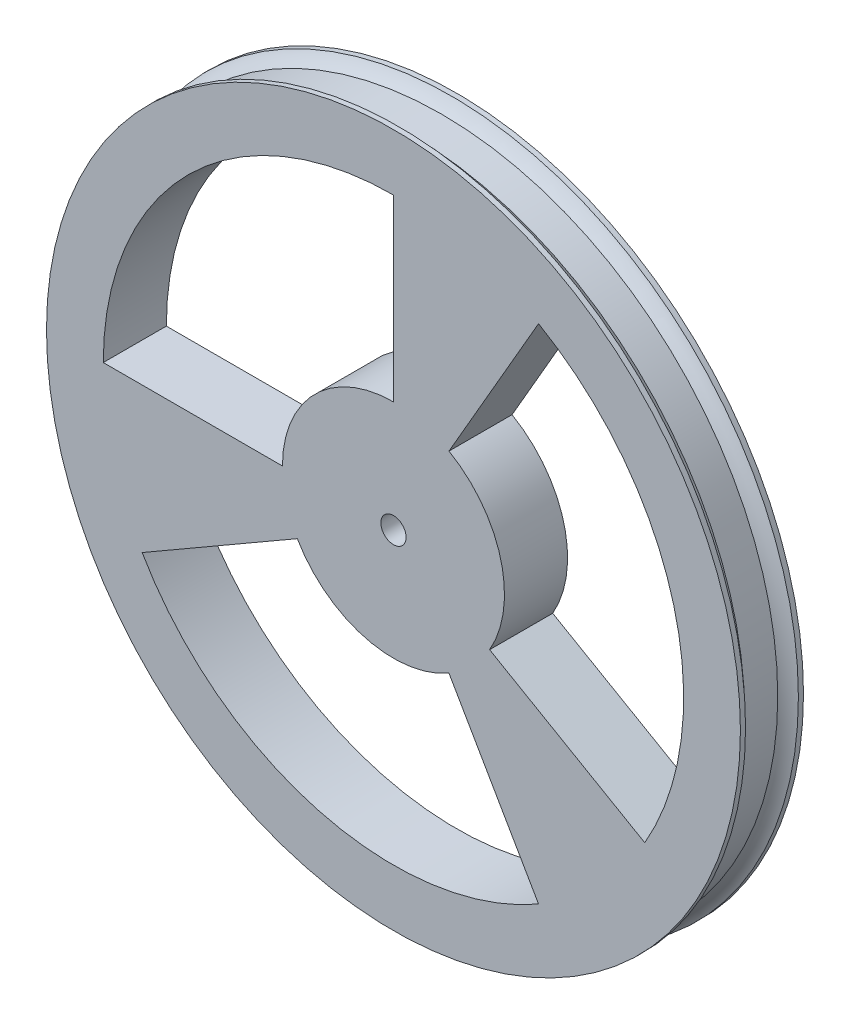
ISO-10303-21;
HEADER;
FILE_DESCRIPTION(('STEP AP214'),'2;1');
FILE_NAME('part.step','',(''),(''),'','','');
FILE_SCHEMA(('AUTOMOTIVE_DESIGN { 1 0 10303 214 1 1 1 1 }'));
ENDSEC;
DATA;
#1=APPLICATION_CONTEXT('core data for automotive mechanical design processes');
#2=APPLICATION_PROTOCOL_DEFINITION('international standard','automotive_design',2000,#1);
#3=PRODUCT_CONTEXT('',#1,'mechanical');
#4=PRODUCT('Part','Part','',(#3));
#5=PRODUCT_RELATED_PRODUCT_CATEGORY('part','',(#4));
#6=PRODUCT_DEFINITION_FORMATION('','',#4);
#7=PRODUCT_DEFINITION_CONTEXT('part definition',#1,'design');
#8=PRODUCT_DEFINITION('design','',#6,#7);
#9=PRODUCT_DEFINITION_SHAPE('','',#8);
#10=(LENGTH_UNIT() NAMED_UNIT(*) SI_UNIT(.MILLI.,.METRE.));
#11=(NAMED_UNIT(*) PLANE_ANGLE_UNIT() SI_UNIT($,.RADIAN.));
#12=(NAMED_UNIT(*) SI_UNIT($,.STERADIAN.) SOLID_ANGLE_UNIT());
#13=UNCERTAINTY_MEASURE_WITH_UNIT(LENGTH_MEASURE(1.E-05),#10,'distance_accuracy_value','');
#14=(GEOMETRIC_REPRESENTATION_CONTEXT(3) GLOBAL_UNCERTAINTY_ASSIGNED_CONTEXT((#13)) GLOBAL_UNIT_ASSIGNED_CONTEXT((#10,
#11,#12)) REPRESENTATION_CONTEXT('',''));
#15=CARTESIAN_POINT('',(0.,0.,0.));
#16=DIRECTION('',(0.,0.,1.));
#17=DIRECTION('',(1.,0.,0.));
#18=AXIS2_PLACEMENT_3D('',#15,#16,#17);
#19=CARTESIAN_POINT('',(0.,0.,5.));
#20=DIRECTION('',(0.,0.,-1.));
#21=DIRECTION('',(-1.,0.,0.));
#22=AXIS2_PLACEMENT_3D('',#19,#20,#21);
#23=CYLINDRICAL_SURFACE('',#22,27.5);
#24=CARTESIAN_POINT('',(0.,0.,5.));
#25=DIRECTION('',(0.,0.,1.));
#26=DIRECTION('',(1.,0.,0.));
#27=AXIS2_PLACEMENT_3D('',#24,#25,#26);
#28=CIRCLE('',#27,27.5);
#29=CARTESIAN_POINT('',(27.5,0.,5.));
#30=VERTEX_POINT('',#29);
#31=EDGE_CURVE('E12',#30,#30,#28,.T.);
#32=ORIENTED_EDGE('',*,*,#31,.F.);
#33=EDGE_LOOP('',(#32));
#34=FACE_BOUND('',#33,.T.);
#35=CARTESIAN_POINT('',(0.,0.,4.59416339647363));
#36=DIRECTION('',(0.,0.,-1.));
#37=DIRECTION('',(-1.,0.,0.));
#38=AXIS2_PLACEMENT_3D('',#35,#36,#37);
#39=CIRCLE('',#38,27.5);
#40=CARTESIAN_POINT('',(-27.5,0.,4.59416339647363));
#41=VERTEX_POINT('',#40);
#42=EDGE_CURVE('E59',#41,#41,#39,.T.);
#43=ORIENTED_EDGE('',*,*,#42,.F.);
#44=EDGE_LOOP('',(#43));
#45=FACE_BOUND('',#44,.T.);
#46=ADVANCED_FACE('F56',(#34,#45),#23,.T.);
#47=CARTESIAN_POINT('',(0.,0.,5.));
#48=DIRECTION('',(0.,0.,1.));
#49=DIRECTION('',(1.,0.,0.));
#50=AXIS2_PLACEMENT_3D('',#47,#48,#49);
#51=PLANE('',#50);
#52=DIRECTION('',(-0.866025403784438,-0.500000000000001,0.));
#53=VECTOR('',#52,1.);
#54=CARTESIAN_POINT('',(0.,0.,5.));
#55=LINE('',#54,#53);
#56=CARTESIAN_POINT('',(-7.62102355330305,-4.40000000000001,5.));
#57=VERTEX_POINT('',#56);
#58=CARTESIAN_POINT('',(-19.9185842870421,-11.5,5.));
#59=VERTEX_POINT('',#58);
#60=EDGE_CURVE('E72',#57,#59,#55,.T.);
#61=ORIENTED_EDGE('',*,*,#60,.F.);
#62=CARTESIAN_POINT('',(0.,0.,5.));
#63=DIRECTION('',(0.,0.,1.));
#64=DIRECTION('',(1.,0.,0.));
#65=AXIS2_PLACEMENT_3D('',#62,#63,#64);
#66=CIRCLE('',#65,8.8);
#67=CARTESIAN_POINT('',(4.39999999999993,-7.6210235533031,5.));
#68=VERTEX_POINT('',#67);
#69=EDGE_CURVE('E162',#57,#68,#66,.T.);
#70=ORIENTED_EDGE('',*,*,#69,.T.);
#71=DIRECTION('',(0.499999999999992,-0.866025403784443,0.));
#72=VECTOR('',#71,1.);
#73=CARTESIAN_POINT('',(0.,0.,5.));
#74=LINE('',#73,#72);
#75=CARTESIAN_POINT('',(11.4999999999998,-19.9185842870422,5.));
#76=VERTEX_POINT('',#75);
#77=EDGE_CURVE('E165',#68,#76,#74,.T.);
#78=ORIENTED_EDGE('',*,*,#77,.T.);
#79=CARTESIAN_POINT('',(0.,0.,5.));
#80=DIRECTION('',(0.,0.,1.));
#81=DIRECTION('',(1.,0.,0.));
#82=AXIS2_PLACEMENT_3D('',#79,#80,#81);
#83=CIRCLE('',#82,23.);
#84=EDGE_CURVE('E171',#59,#76,#83,.T.);
#85=ORIENTED_EDGE('',*,*,#84,.F.);
#86=EDGE_LOOP('',(#61,#70,#78,#85));
#87=FACE_BOUND('',#86,.T.);
#88=DIRECTION('',(0.866025403784435,-0.500000000000007,0.));
#89=VECTOR('',#88,1.);
#90=CARTESIAN_POINT('',(0.,0.,5.));
#91=LINE('',#90,#89);
#92=CARTESIAN_POINT('',(7.62102355330303,-4.40000000000006,5.));
#93=VERTEX_POINT('',#92);
#94=CARTESIAN_POINT('',(19.918584287042,-11.5000000000001,5.));
#95=VERTEX_POINT('',#94);
#96=EDGE_CURVE('E177',#93,#95,#91,.T.);
#97=ORIENTED_EDGE('',*,*,#96,.F.);
#98=CARTESIAN_POINT('',(0.,0.,5.));
#99=DIRECTION('',(0.,0.,1.));
#100=DIRECTION('',(1.,0.,0.));
#101=AXIS2_PLACEMENT_3D('',#98,#99,#100);
#102=CIRCLE('',#101,8.8);
#103=CARTESIAN_POINT('',(4.40000000000006,7.62102355330303,5.));
#104=VERTEX_POINT('',#103);
#105=EDGE_CURVE('E185',#93,#104,#102,.T.);
#106=ORIENTED_EDGE('',*,*,#105,.T.);
#107=DIRECTION('',(0.500000000000006,0.866025403784435,0.));
#108=VECTOR('',#107,1.);
#109=CARTESIAN_POINT('',(0.,0.,5.));
#110=LINE('',#109,#108);
#111=CARTESIAN_POINT('',(11.5000000000001,19.918584287042,5.));
#112=VERTEX_POINT('',#111);
#113=EDGE_CURVE('E198',#104,#112,#110,.T.);
#114=ORIENTED_EDGE('',*,*,#113,.T.);
#115=CARTESIAN_POINT('',(0.,0.,5.));
#116=DIRECTION('',(0.,0.,1.));
#117=DIRECTION('',(1.,0.,0.));
#118=AXIS2_PLACEMENT_3D('',#115,#116,#117);
#119=CIRCLE('',#118,23.);
#120=EDGE_CURVE('E195',#95,#112,#119,.T.);
#121=ORIENTED_EDGE('',*,*,#120,.F.);
#122=EDGE_LOOP('',(#97,#106,#114,#121));
#123=FACE_BOUND('',#122,.T.);
#124=DIRECTION('',(0.,1.,0.));
#125=VECTOR('',#124,1.);
#126=CARTESIAN_POINT('',(0.,0.,5.));
#127=LINE('',#126,#125);
#128=CARTESIAN_POINT('',(0.,8.8,5.));
#129=VERTEX_POINT('',#128);
#130=CARTESIAN_POINT('',(0.,23.,5.));
#131=VERTEX_POINT('',#130);
#132=EDGE_CURVE('E205',#129,#131,#127,.T.);
#133=ORIENTED_EDGE('',*,*,#132,.F.);
#134=CARTESIAN_POINT('',(0.,0.,5.));
#135=DIRECTION('',(0.,0.,1.));
#136=DIRECTION('',(1.,0.,0.));
#137=AXIS2_PLACEMENT_3D('',#134,#135,#136);
#138=CIRCLE('',#137,8.8);
#139=CARTESIAN_POINT('',(-8.8,0.,5.));
#140=VERTEX_POINT('',#139);
#141=EDGE_CURVE('E216',#129,#140,#138,.T.);
#142=ORIENTED_EDGE('',*,*,#141,.T.);
#143=DIRECTION('',(-1.,0.,0.));
#144=VECTOR('',#143,1.);
#145=CARTESIAN_POINT('',(0.,0.,5.));
#146=LINE('',#145,#144);
#147=CARTESIAN_POINT('',(-23.,0.,5.));
#148=VERTEX_POINT('',#147);
#149=EDGE_CURVE('E229',#140,#148,#146,.T.);
#150=ORIENTED_EDGE('',*,*,#149,.T.);
#151=CARTESIAN_POINT('',(0.,0.,5.));
#152=DIRECTION('',(0.,0.,1.));
#153=DIRECTION('',(1.,0.,0.));
#154=AXIS2_PLACEMENT_3D('',#151,#152,#153);
#155=CIRCLE('',#154,23.);
#156=EDGE_CURVE('E226',#131,#148,#155,.T.);
#157=ORIENTED_EDGE('',*,*,#156,.F.);
#158=EDGE_LOOP('',(#133,#142,#150,#157));
#159=FACE_BOUND('',#158,.T.);
#160=CARTESIAN_POINT('',(0.,0.,5.));
#161=DIRECTION('',(0.,0.,1.));
#162=DIRECTION('',(1.,0.,0.));
#163=AXIS2_PLACEMENT_3D('',#160,#161,#162);
#164=CIRCLE('',#163,1.);
#165=CARTESIAN_POINT('',(1.,0.,5.));
#166=VERTEX_POINT('',#165);
#167=EDGE_CURVE('E236',#166,#166,#164,.T.);
#168=ORIENTED_EDGE('',*,*,#167,.F.);
#169=EDGE_LOOP('',(#168));
#170=FACE_BOUND('',#169,.T.);
#171=ORIENTED_EDGE('',*,*,#31,.T.);
#172=EDGE_LOOP('',(#171));
#173=FACE_BOUND('',#172,.T.);
#174=ADVANCED_FACE('F265',(#87,#123,#159,#170,#173),#51,.T.);
#175=CARTESIAN_POINT('',(0.,0.,2.5));
#176=DIRECTION('',(0.,0.,1.));
#177=DIRECTION('',(1.,0.,0.));
#178=AXIS2_PLACEMENT_3D('',#175,#176,#177);
#179=TOROIDAL_SURFACE('',#178,28.6468907779138,2.38765131197873);
#180=CARTESIAN_POINT('',(0.,0.,3.80847837704561));
#181=DIRECTION('',(0.,0.,1.));
#182=DIRECTION('',(1.,0.,0.));
#183=AXIS2_PLACEMENT_3D('',#180,#181,#182);
#184=CIRCLE('',#183,26.6497019725181);
#185=CARTESIAN_POINT('',(26.6497019725181,0.,3.80847837704561));
#186=VERTEX_POINT('',#185);
#187=EDGE_CURVE('E246',#186,#186,#184,.T.);
#188=ORIENTED_EDGE('',*,*,#187,.T.);
#189=EDGE_LOOP('',(#188));
#190=FACE_BOUND('',#189,.T.);
#191=ORIENTED_EDGE('',*,*,#42,.T.);
#192=EDGE_LOOP('',(#191));
#193=FACE_BOUND('',#192,.T.);
#194=ADVANCED_FACE('F262',(#190,#193),#179,.F.);
#195=CARTESIAN_POINT('',(0.,0.,1.19152162295439));
#196=DIRECTION('',(0.,0.,1.));
#197=DIRECTION('',(1.,0.,0.));
#198=AXIS2_PLACEMENT_3D('',#195,#196,#197);
#199=CIRCLE('',#198,26.6497019725181);
#200=CARTESIAN_POINT('',(26.6497019725181,0.,1.19152162295439));
#201=VERTEX_POINT('',#200);
#202=EDGE_CURVE('E251',#201,#201,#199,.T.);
#203=ORIENTED_EDGE('',*,*,#202,.F.);
#204=EDGE_LOOP('',(#203));
#205=FACE_BOUND('',#204,.T.);
#206=CARTESIAN_POINT('',(0.,0.,0.405836603526367));
#207=DIRECTION('',(0.,0.,1.));
#208=DIRECTION('',(1.,0.,0.));
#209=AXIS2_PLACEMENT_3D('',#206,#207,#208);
#210=CIRCLE('',#209,27.5);
#211=CARTESIAN_POINT('',(27.5,0.,0.405836603526367));
#212=VERTEX_POINT('',#211);
#213=EDGE_CURVE('E253',#212,#212,#210,.T.);
#214=ORIENTED_EDGE('',*,*,#213,.T.);
#215=EDGE_LOOP('',(#214));
#216=FACE_BOUND('',#215,.T.);
#217=ADVANCED_FACE('F291',(#205,#216),#179,.F.);
#218=CARTESIAN_POINT('',(0.,0.,5.));
#219=DIRECTION('',(0.,0.,1.));
#220=DIRECTION('',(1.,0.,0.));
#221=AXIS2_PLACEMENT_3D('',#218,#219,#220);
#222=CYLINDRICAL_SURFACE('',#221,26.6497019725181);
#223=ORIENTED_EDGE('',*,*,#202,.T.);
#224=EDGE_LOOP('',(#223));
#225=FACE_BOUND('',#224,.T.);
#226=ORIENTED_EDGE('',*,*,#187,.F.);
#227=EDGE_LOOP('',(#226));
#228=FACE_BOUND('',#227,.T.);
#229=ADVANCED_FACE('F284',(#225,#228),#222,.T.);
#230=CARTESIAN_POINT('',(0.,0.,0.));
#231=DIRECTION('',(0.,0.,1.));
#232=DIRECTION('',(1.,0.,0.));
#233=AXIS2_PLACEMENT_3D('',#230,#231,#232);
#234=PLANE('',#233);
#235=CARTESIAN_POINT('',(0.,0.,0.));
#236=DIRECTION('',(0.,0.,1.));
#237=DIRECTION('',(1.,0.,0.));
#238=AXIS2_PLACEMENT_3D('',#235,#236,#237);
#239=CIRCLE('',#238,8.8);
#240=CARTESIAN_POINT('',(-7.62102355330305,-4.40000000000001,0.));
#241=VERTEX_POINT('',#240);
#242=CARTESIAN_POINT('',(4.39999999999993,-7.6210235533031,0.));
#243=VERTEX_POINT('',#242);
#244=EDGE_CURVE('E151',#241,#243,#239,.T.);
#245=ORIENTED_EDGE('',*,*,#244,.F.);
#246=DIRECTION('',(-0.866025403784438,-0.500000000000001,0.));
#247=VECTOR('',#246,1.);
#248=CARTESIAN_POINT('',(0.,0.,0.));
#249=LINE('',#248,#247);
#250=CARTESIAN_POINT('',(-19.9185842870421,-11.5,0.));
#251=VERTEX_POINT('',#250);
#252=EDGE_CURVE('E148',#241,#251,#249,.T.);
#253=ORIENTED_EDGE('',*,*,#252,.T.);
#254=CARTESIAN_POINT('',(0.,0.,0.));
#255=DIRECTION('',(0.,0.,1.));
#256=DIRECTION('',(1.,0.,0.));
#257=AXIS2_PLACEMENT_3D('',#254,#255,#256);
#258=CIRCLE('',#257,23.);
#259=CARTESIAN_POINT('',(11.4999999999998,-19.9185842870422,0.));
#260=VERTEX_POINT('',#259);
#261=EDGE_CURVE('E154',#251,#260,#258,.T.);
#262=ORIENTED_EDGE('',*,*,#261,.T.);
#263=DIRECTION('',(0.499999999999992,-0.866025403784443,0.));
#264=VECTOR('',#263,1.);
#265=CARTESIAN_POINT('',(0.,0.,0.));
#266=LINE('',#265,#264);
#267=EDGE_CURVE('E158',#243,#260,#266,.T.);
#268=ORIENTED_EDGE('',*,*,#267,.F.);
#269=EDGE_LOOP('',(#245,#253,#262,#268));
#270=FACE_BOUND('',#269,.T.);
#271=CARTESIAN_POINT('',(0.,0.,0.));
#272=DIRECTION('',(0.,0.,1.));
#273=DIRECTION('',(1.,0.,0.));
#274=AXIS2_PLACEMENT_3D('',#271,#272,#273);
#275=CIRCLE('',#274,8.8);
#276=CARTESIAN_POINT('',(7.62102355330303,-4.40000000000006,0.));
#277=VERTEX_POINT('',#276);
#278=CARTESIAN_POINT('',(4.40000000000006,7.62102355330303,0.));
#279=VERTEX_POINT('',#278);
#280=EDGE_CURVE('E191',#277,#279,#275,.T.);
#281=ORIENTED_EDGE('',*,*,#280,.F.);
#282=DIRECTION('',(0.866025403784435,-0.500000000000007,0.));
#283=VECTOR('',#282,1.);
#284=CARTESIAN_POINT('',(0.,0.,0.));
#285=LINE('',#284,#283);
#286=CARTESIAN_POINT('',(19.918584287042,-11.5000000000002,0.));
#287=VERTEX_POINT('',#286);
#288=EDGE_CURVE('E181',#277,#287,#285,.T.);
#289=ORIENTED_EDGE('',*,*,#288,.T.);
#290=CARTESIAN_POINT('',(0.,0.,0.));
#291=DIRECTION('',(0.,0.,1.));
#292=DIRECTION('',(1.,0.,0.));
#293=AXIS2_PLACEMENT_3D('',#290,#291,#292);
#294=CIRCLE('',#293,23.);
#295=CARTESIAN_POINT('',(11.5000000000001,19.918584287042,0.));
#296=VERTEX_POINT('',#295);
#297=EDGE_CURVE('E184',#287,#296,#294,.T.);
#298=ORIENTED_EDGE('',*,*,#297,.T.);
#299=DIRECTION('',(0.500000000000006,0.866025403784435,0.));
#300=VECTOR('',#299,1.);
#301=CARTESIAN_POINT('',(0.,0.,0.));
#302=LINE('',#301,#300);
#303=EDGE_CURVE('E188',#279,#296,#302,.T.);
#304=ORIENTED_EDGE('',*,*,#303,.F.);
#305=EDGE_LOOP('',(#281,#289,#298,#304));
#306=FACE_BOUND('',#305,.T.);
#307=CARTESIAN_POINT('',(0.,0.,0.));
#308=DIRECTION('',(0.,0.,1.));
#309=DIRECTION('',(1.,0.,0.));
#310=AXIS2_PLACEMENT_3D('',#307,#308,#309);
#311=CIRCLE('',#310,8.8);
#312=CARTESIAN_POINT('',(0.,8.8,0.));
#313=VERTEX_POINT('',#312);
#314=CARTESIAN_POINT('',(-8.8,0.,0.));
#315=VERTEX_POINT('',#314);
#316=EDGE_CURVE('E222',#313,#315,#311,.T.);
#317=ORIENTED_EDGE('',*,*,#316,.F.);
#318=DIRECTION('',(0.,1.,0.));
#319=VECTOR('',#318,1.);
#320=CARTESIAN_POINT('',(0.,0.,0.));
#321=LINE('',#320,#319);
#322=CARTESIAN_POINT('',(0.,23.,0.));
#323=VERTEX_POINT('',#322);
#324=EDGE_CURVE('E212',#313,#323,#321,.T.);
#325=ORIENTED_EDGE('',*,*,#324,.T.);
#326=CARTESIAN_POINT('',(0.,0.,0.));
#327=DIRECTION('',(0.,0.,1.));
#328=DIRECTION('',(1.,0.,0.));
#329=AXIS2_PLACEMENT_3D('',#326,#327,#328);
#330=CIRCLE('',#329,23.);
#331=CARTESIAN_POINT('',(-23.,0.,0.));
#332=VERTEX_POINT('',#331);
#333=EDGE_CURVE('E215',#323,#332,#330,.T.);
#334=ORIENTED_EDGE('',*,*,#333,.T.);
#335=DIRECTION('',(-1.,0.,0.));
#336=VECTOR('',#335,1.);
#337=CARTESIAN_POINT('',(0.,0.,0.));
#338=LINE('',#337,#336);
#339=EDGE_CURVE('E219',#315,#332,#338,.T.);
#340=ORIENTED_EDGE('',*,*,#339,.F.);
#341=EDGE_LOOP('',(#317,#325,#334,#340));
#342=FACE_BOUND('',#341,.T.);
#343=CARTESIAN_POINT('',(0.,0.,0.));
#344=DIRECTION('',(0.,0.,1.));
#345=DIRECTION('',(1.,0.,0.));
#346=AXIS2_PLACEMENT_3D('',#343,#344,#345);
#347=CIRCLE('',#346,1.);
#348=CARTESIAN_POINT('',(1.,0.,0.));
#349=VERTEX_POINT('',#348);
#350=EDGE_CURVE('E243',#349,#349,#347,.T.);
#351=ORIENTED_EDGE('',*,*,#350,.T.);
#352=EDGE_LOOP('',(#351));
#353=FACE_BOUND('',#352,.T.);
#354=CARTESIAN_POINT('',(0.,0.,0.));
#355=DIRECTION('',(0.,0.,1.));
#356=DIRECTION('',(1.,0.,0.));
#357=AXIS2_PLACEMENT_3D('',#354,#355,#356);
#358=CIRCLE('',#357,27.5);
#359=CARTESIAN_POINT('',(27.5,0.,0.));
#360=VERTEX_POINT('',#359);
#361=EDGE_CURVE('E64',#360,#360,#358,.T.);
#362=ORIENTED_EDGE('',*,*,#361,.F.);
#363=EDGE_LOOP('',(#362));
#364=FACE_BOUND('',#363,.T.);
#365=ADVANCED_FACE('F160',(#270,#306,#342,#353,#364),#234,.F.);
#366=ORIENTED_EDGE('',*,*,#361,.T.);
#367=EDGE_LOOP('',(#366));
#368=FACE_BOUND('',#367,.T.);
#369=ORIENTED_EDGE('',*,*,#213,.F.);
#370=EDGE_LOOP('',(#369));
#371=FACE_BOUND('',#370,.T.);
#372=ADVANCED_FACE('F267',(#368,#371),#23,.T.);
#373=CARTESIAN_POINT('',(0.,0.,0.));
#374=DIRECTION('',(0.,0.,1.));
#375=DIRECTION('',(1.,0.,0.));
#376=AXIS2_PLACEMENT_3D('',#373,#374,#375);
#377=CYLINDRICAL_SURFACE('',#376,1.);
#378=ORIENTED_EDGE('',*,*,#350,.F.);
#379=EDGE_LOOP('',(#378));
#380=FACE_BOUND('',#379,.T.);
#381=ORIENTED_EDGE('',*,*,#167,.T.);
#382=EDGE_LOOP('',(#381));
#383=FACE_BOUND('',#382,.T.);
#384=ADVANCED_FACE('F275',(#380,#383),#377,.F.);
#385=CARTESIAN_POINT('',(0.,0.,0.));
#386=DIRECTION('',(1.,0.,0.));
#387=DIRECTION('',(0.,0.,-1.));
#388=AXIS2_PLACEMENT_3D('',#385,#386,#387);
#389=PLANE('',#388);
#390=ORIENTED_EDGE('',*,*,#132,.T.);
#391=DIRECTION('',(0.,0.,1.));
#392=VECTOR('',#391,1.);
#393=CARTESIAN_POINT('',(0.,23.,0.));
#394=LINE('',#393,#392);
#395=EDGE_CURVE('E224',#323,#131,#394,.T.);
#396=ORIENTED_EDGE('',*,*,#395,.F.);
#397=ORIENTED_EDGE('',*,*,#324,.F.);
#398=DIRECTION('',(0.,0.,1.));
#399=VECTOR('',#398,1.);
#400=CARTESIAN_POINT('',(0.,8.8,0.));
#401=LINE('',#400,#399);
#402=EDGE_CURVE('E234',#313,#129,#401,.T.);
#403=ORIENTED_EDGE('',*,*,#402,.T.);
#404=EDGE_LOOP('',(#390,#396,#397,#403));
#405=FACE_BOUND('',#404,.T.);
#406=ADVANCED_FACE('F281',(#405),#389,.F.);
#407=CARTESIAN_POINT('',(0.,0.,0.));
#408=DIRECTION('',(0.,0.,1.));
#409=DIRECTION('',(1.,0.,0.));
#410=AXIS2_PLACEMENT_3D('',#407,#408,#409);
#411=CYLINDRICAL_SURFACE('',#410,8.8);
#412=ORIENTED_EDGE('',*,*,#141,.F.);
#413=ORIENTED_EDGE('',*,*,#402,.F.);
#414=ORIENTED_EDGE('',*,*,#316,.T.);
#415=DIRECTION('',(0.,0.,1.));
#416=VECTOR('',#415,1.);
#417=CARTESIAN_POINT('',(-8.8,0.,0.));
#418=LINE('',#417,#416);
#419=EDGE_CURVE('E237',#315,#140,#418,.T.);
#420=ORIENTED_EDGE('',*,*,#419,.T.);
#421=EDGE_LOOP('',(#412,#413,#414,#420));
#422=FACE_BOUND('',#421,.T.);
#423=ADVANCED_FACE('F300',(#422),#411,.T.);
#424=CARTESIAN_POINT('',(0.,0.,0.));
#425=DIRECTION('',(0.,1.,0.));
#426=DIRECTION('',(0.,0.,1.));
#427=AXIS2_PLACEMENT_3D('',#424,#425,#426);
#428=PLANE('',#427);
#429=ORIENTED_EDGE('',*,*,#149,.F.);
#430=ORIENTED_EDGE('',*,*,#419,.F.);
#431=ORIENTED_EDGE('',*,*,#339,.T.);
#432=DIRECTION('',(0.,0.,1.));
#433=VECTOR('',#432,1.);
#434=CARTESIAN_POINT('',(-23.,0.,0.));
#435=LINE('',#434,#433);
#436=EDGE_CURVE('E239',#332,#148,#435,.T.);
#437=ORIENTED_EDGE('',*,*,#436,.T.);
#438=EDGE_LOOP('',(#429,#430,#431,#437));
#439=FACE_BOUND('',#438,.T.);
#440=ADVANCED_FACE('F306',(#439),#428,.T.);
#441=CARTESIAN_POINT('',(0.,0.,0.));
#442=DIRECTION('',(0.,0.,1.));
#443=DIRECTION('',(1.,0.,0.));
#444=AXIS2_PLACEMENT_3D('',#441,#442,#443);
#445=CYLINDRICAL_SURFACE('',#444,23.);
#446=ORIENTED_EDGE('',*,*,#156,.T.);
#447=ORIENTED_EDGE('',*,*,#436,.F.);
#448=ORIENTED_EDGE('',*,*,#333,.F.);
#449=ORIENTED_EDGE('',*,*,#395,.T.);
#450=EDGE_LOOP('',(#446,#447,#448,#449));
#451=FACE_BOUND('',#450,.T.);
#452=ADVANCED_FACE('F302',(#451),#445,.F.);
#453=CARTESIAN_POINT('',(0.,0.,0.));
#454=DIRECTION('',(-0.500000000000007,-0.866025403784435,0.));
#455=DIRECTION('',(0.866025403784435,-0.500000000000007,0.));
#456=AXIS2_PLACEMENT_3D('',#453,#454,#455);
#457=PLANE('',#456);
#458=ORIENTED_EDGE('',*,*,#96,.T.);
#459=DIRECTION('',(0.,0.,1.));
#460=VECTOR('',#459,1.);
#461=CARTESIAN_POINT('',(19.918584287042,-11.5000000000002,0.));
#462=LINE('',#461,#460);
#463=EDGE_CURVE('E193',#287,#95,#462,.T.);
#464=ORIENTED_EDGE('',*,*,#463,.F.);
#465=ORIENTED_EDGE('',*,*,#288,.F.);
#466=DIRECTION('',(0.,0.,1.));
#467=VECTOR('',#466,1.);
#468=CARTESIAN_POINT('',(7.62102355330303,-4.40000000000006,0.));
#469=LINE('',#468,#467);
#470=EDGE_CURVE('E203',#277,#93,#469,.T.);
#471=ORIENTED_EDGE('',*,*,#470,.T.);
#472=EDGE_LOOP('',(#458,#464,#465,#471));
#473=FACE_BOUND('',#472,.T.);
#474=ADVANCED_FACE('F305',(#473),#457,.F.);
#475=CARTESIAN_POINT('',(0.,0.,0.));
#476=DIRECTION('',(0.,0.,1.));
#477=DIRECTION('',(1.,0.,0.));
#478=AXIS2_PLACEMENT_3D('',#475,#476,#477);
#479=CYLINDRICAL_SURFACE('',#478,8.8);
#480=ORIENTED_EDGE('',*,*,#105,.F.);
#481=ORIENTED_EDGE('',*,*,#470,.F.);
#482=ORIENTED_EDGE('',*,*,#280,.T.);
#483=DIRECTION('',(0.,0.,1.));
#484=VECTOR('',#483,1.);
#485=CARTESIAN_POINT('',(4.40000000000006,7.62102355330303,0.));
#486=LINE('',#485,#484);
#487=EDGE_CURVE('E206',#279,#104,#486,.T.);
#488=ORIENTED_EDGE('',*,*,#487,.T.);
#489=EDGE_LOOP('',(#480,#481,#482,#488));
#490=FACE_BOUND('',#489,.T.);
#491=ADVANCED_FACE('F316',(#490),#479,.T.);
#492=CARTESIAN_POINT('',(0.,0.,0.));
#493=DIRECTION('',(0.866025403784435,-0.500000000000006,0.));
#494=DIRECTION('',(0.500000000000006,0.866025403784435,0.));
#495=AXIS2_PLACEMENT_3D('',#492,#493,#494);
#496=PLANE('',#495);
#497=ORIENTED_EDGE('',*,*,#113,.F.);
#498=ORIENTED_EDGE('',*,*,#487,.F.);
#499=ORIENTED_EDGE('',*,*,#303,.T.);
#500=DIRECTION('',(0.,0.,1.));
#501=VECTOR('',#500,1.);
#502=CARTESIAN_POINT('',(11.5000000000001,19.918584287042,0.));
#503=LINE('',#502,#501);
#504=EDGE_CURVE('E208',#296,#112,#503,.T.);
#505=ORIENTED_EDGE('',*,*,#504,.T.);
#506=EDGE_LOOP('',(#497,#498,#499,#505));
#507=FACE_BOUND('',#506,.T.);
#508=ADVANCED_FACE('F321',(#507),#496,.T.);
#509=CARTESIAN_POINT('',(0.,0.,0.));
#510=DIRECTION('',(0.,0.,1.));
#511=DIRECTION('',(1.,0.,0.));
#512=AXIS2_PLACEMENT_3D('',#509,#510,#511);
#513=CYLINDRICAL_SURFACE('',#512,23.);
#514=ORIENTED_EDGE('',*,*,#120,.T.);
#515=ORIENTED_EDGE('',*,*,#504,.F.);
#516=ORIENTED_EDGE('',*,*,#297,.F.);
#517=ORIENTED_EDGE('',*,*,#463,.T.);
#518=EDGE_LOOP('',(#514,#515,#516,#517));
#519=FACE_BOUND('',#518,.T.);
#520=ADVANCED_FACE('F318',(#519),#513,.F.);
#521=CARTESIAN_POINT('',(0.,0.,0.));
#522=DIRECTION('',(-0.500000000000001,0.866025403784438,0.));
#523=DIRECTION('',(-0.866025403784438,-0.500000000000001,0.));
#524=AXIS2_PLACEMENT_3D('',#521,#522,#523);
#525=PLANE('',#524);
#526=ORIENTED_EDGE('',*,*,#60,.T.);
#527=DIRECTION('',(0.,0.,1.));
#528=VECTOR('',#527,1.);
#529=CARTESIAN_POINT('',(-19.9185842870421,-11.5,0.));
#530=LINE('',#529,#528);
#531=EDGE_CURVE('E145',#251,#59,#530,.T.);
#532=ORIENTED_EDGE('',*,*,#531,.F.);
#533=ORIENTED_EDGE('',*,*,#252,.F.);
#534=DIRECTION('',(0.,0.,1.));
#535=VECTOR('',#534,1.);
#536=CARTESIAN_POINT('',(-7.62102355330305,-4.40000000000001,0.));
#537=LINE('',#536,#535);
#538=EDGE_CURVE('E175',#241,#57,#537,.T.);
#539=ORIENTED_EDGE('',*,*,#538,.T.);
#540=EDGE_LOOP('',(#526,#532,#533,#539));
#541=FACE_BOUND('',#540,.T.);
#542=ADVANCED_FACE('F146',(#541),#525,.F.);
#543=CARTESIAN_POINT('',(0.,0.,0.));
#544=DIRECTION('',(0.,0.,1.));
#545=DIRECTION('',(1.,0.,0.));
#546=AXIS2_PLACEMENT_3D('',#543,#544,#545);
#547=CYLINDRICAL_SURFACE('',#546,8.8);
#548=ORIENTED_EDGE('',*,*,#69,.F.);
#549=ORIENTED_EDGE('',*,*,#538,.F.);
#550=ORIENTED_EDGE('',*,*,#244,.T.);
#551=DIRECTION('',(0.,0.,1.));
#552=VECTOR('',#551,1.);
#553=CARTESIAN_POINT('',(4.39999999999993,-7.6210235533031,0.));
#554=LINE('',#553,#552);
#555=EDGE_CURVE('E178',#243,#68,#554,.T.);
#556=ORIENTED_EDGE('',*,*,#555,.T.);
#557=EDGE_LOOP('',(#548,#549,#550,#556));
#558=FACE_BOUND('',#557,.T.);
#559=ADVANCED_FACE('F331',(#558),#547,.T.);
#560=CARTESIAN_POINT('',(0.,0.,0.));
#561=DIRECTION('',(-0.866025403784443,-0.499999999999992,0.));
#562=DIRECTION('',(0.499999999999992,-0.866025403784443,0.));
#563=AXIS2_PLACEMENT_3D('',#560,#561,#562);
#564=PLANE('',#563);
#565=ORIENTED_EDGE('',*,*,#77,.F.);
#566=ORIENTED_EDGE('',*,*,#555,.F.);
#567=ORIENTED_EDGE('',*,*,#267,.T.);
#568=DIRECTION('',(0.,0.,1.));
#569=VECTOR('',#568,1.);
#570=CARTESIAN_POINT('',(11.4999999999998,-19.9185842870422,0.));
#571=LINE('',#570,#569);
#572=EDGE_CURVE('E80',#260,#76,#571,.T.);
#573=ORIENTED_EDGE('',*,*,#572,.T.);
#574=EDGE_LOOP('',(#565,#566,#567,#573));
#575=FACE_BOUND('',#574,.T.);
#576=ADVANCED_FACE('F334',(#575),#564,.T.);
#577=CARTESIAN_POINT('',(0.,0.,0.));
#578=DIRECTION('',(0.,0.,1.));
#579=DIRECTION('',(1.,0.,0.));
#580=AXIS2_PLACEMENT_3D('',#577,#578,#579);
#581=CYLINDRICAL_SURFACE('',#580,23.);
#582=ORIENTED_EDGE('',*,*,#84,.T.);
#583=ORIENTED_EDGE('',*,*,#572,.F.);
#584=ORIENTED_EDGE('',*,*,#261,.F.);
#585=ORIENTED_EDGE('',*,*,#531,.T.);
#586=EDGE_LOOP('',(#582,#583,#584,#585));
#587=FACE_BOUND('',#586,.T.);
#588=ADVANCED_FACE('F155',(#587),#581,.F.);
#589=CLOSED_SHELL('',(#46,#174,#194,#217,#229,#365,#372,#384,#406,#423,#440,#452,#474,#491,#508,
#520,#542,#559,#576,#588));
#590=MANIFOLD_SOLID_BREP('B2',#589);
#591=ADVANCED_BREP_SHAPE_REPRESENTATION('',(#18,#590),#14);
#592=SHAPE_DEFINITION_REPRESENTATION(#9,#591);
ENDSEC;
END-ISO-10303-21;
